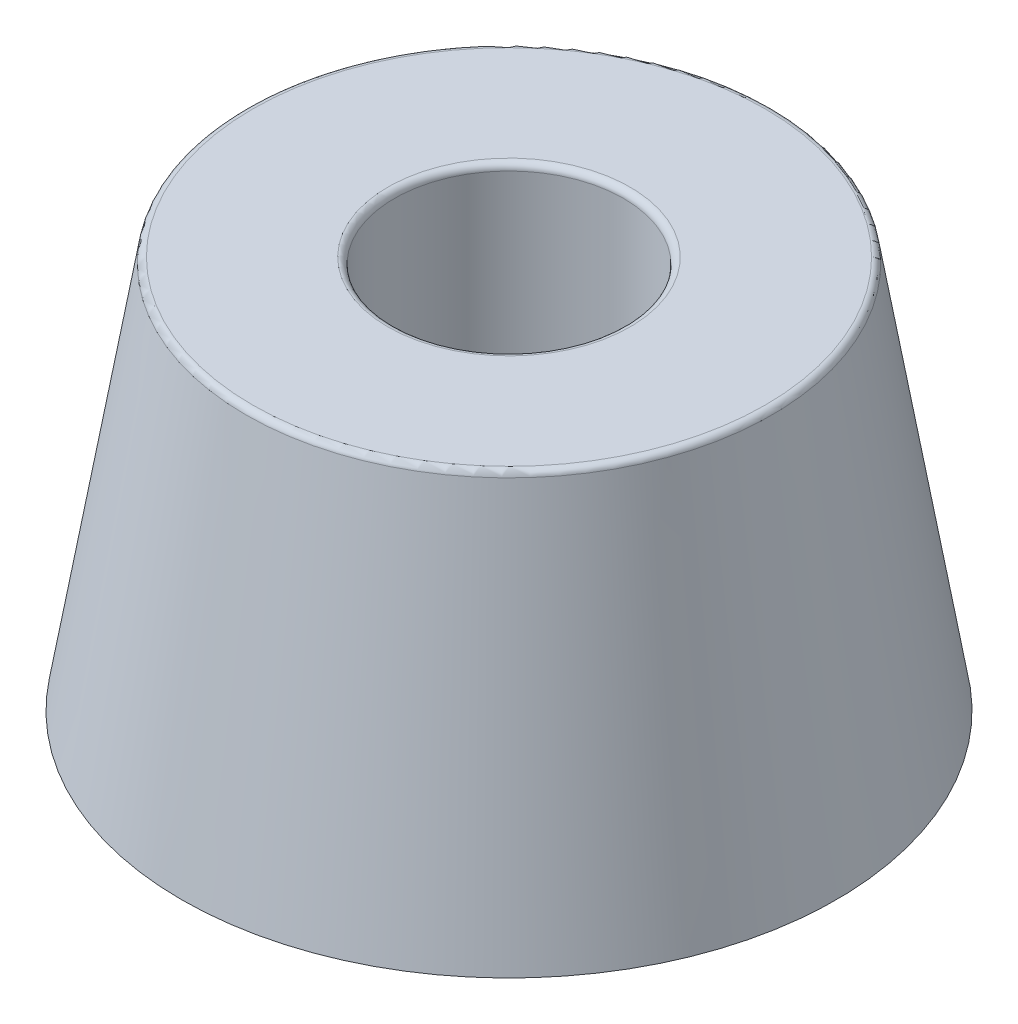
ISO-10303-21;
HEADER;
FILE_DESCRIPTION(('STEP AP214'),'2;1');
FILE_NAME('part.step','',(''),(''),'','','');
FILE_SCHEMA(('AUTOMOTIVE_DESIGN { 1 0 10303 214 1 1 1 1 }'));
ENDSEC;
DATA;
#1=APPLICATION_CONTEXT('core data for automotive mechanical design processes');
#2=APPLICATION_PROTOCOL_DEFINITION('international standard','automotive_design',2000,#1);
#3=PRODUCT_CONTEXT('',#1,'mechanical');
#4=PRODUCT('Part','Part','',(#3));
#5=PRODUCT_RELATED_PRODUCT_CATEGORY('part','',(#4));
#6=PRODUCT_DEFINITION_FORMATION('','',#4);
#7=PRODUCT_DEFINITION_CONTEXT('part definition',#1,'design');
#8=PRODUCT_DEFINITION('design','',#6,#7);
#9=PRODUCT_DEFINITION_SHAPE('','',#8);
#10=(LENGTH_UNIT() NAMED_UNIT(*) SI_UNIT(.MILLI.,.METRE.));
#11=(NAMED_UNIT(*) PLANE_ANGLE_UNIT() SI_UNIT($,.RADIAN.));
#12=(NAMED_UNIT(*) SI_UNIT($,.STERADIAN.) SOLID_ANGLE_UNIT());
#13=UNCERTAINTY_MEASURE_WITH_UNIT(LENGTH_MEASURE(1.E-05),#10,'distance_accuracy_value','');
#14=(GEOMETRIC_REPRESENTATION_CONTEXT(3) GLOBAL_UNCERTAINTY_ASSIGNED_CONTEXT((#13)) GLOBAL_UNIT_ASSIGNED_CONTEXT((#10,
#11,#12)) REPRESENTATION_CONTEXT('',''));
#15=CARTESIAN_POINT('',(0.,0.,0.));
#16=DIRECTION('',(0.,0.,1.));
#17=DIRECTION('',(1.,0.,0.));
#18=AXIS2_PLACEMENT_3D('',#15,#16,#17);
#19=CARTESIAN_POINT('',(0.,12.,0.));
#20=DIRECTION('',(0.,1.,0.));
#21=DIRECTION('',(0.,0.,1.));
#22=AXIS2_PLACEMENT_3D('',#19,#20,#21);
#23=PLANE('',#22);
#24=CARTESIAN_POINT('',(0.,12.,0.));
#25=DIRECTION('',(0.,1.,0.));
#26=DIRECTION('',(0.,0.,1.));
#27=AXIS2_PLACEMENT_3D('',#24,#25,#26);
#28=CIRCLE('',#27,7.83057458232339);
#29=CARTESIAN_POINT('',(0.,12.,7.83057458232339));
#30=VERTEX_POINT('',#29);
#31=EDGE_CURVE('E22',#30,#30,#28,.T.);
#32=ORIENTED_EDGE('',*,*,#31,.T.);
#33=EDGE_LOOP('',(#32));
#34=FACE_BOUND('',#33,.T.);
#35=CARTESIAN_POINT('',(0.,12.,0.));
#36=DIRECTION('',(0.,1.,0.));
#37=DIRECTION('',(0.,0.,1.));
#38=AXIS2_PLACEMENT_3D('',#35,#36,#37);
#39=CIRCLE('',#38,3.7);
#40=CARTESIAN_POINT('',(0.,12.,3.7));
#41=VERTEX_POINT('',#40);
#42=EDGE_CURVE('E26',#41,#41,#39,.F.);
#43=ORIENTED_EDGE('',*,*,#42,.T.);
#44=EDGE_LOOP('',(#43));
#45=FACE_BOUND('',#44,.T.);
#46=ADVANCED_FACE('F15',(#34,#45),#23,.T.);
#47=CARTESIAN_POINT('',(0.,0.,0.));
#48=DIRECTION('',(0.,-1.,0.));
#49=DIRECTION('',(0.,0.,-1.));
#50=AXIS2_PLACEMENT_3D('',#47,#48,#49);
#51=CONICAL_SURFACE('',#50,10.,0.165148677414627);
#52=CARTESIAN_POINT('',(0.,11.8328797974611,0.));
#53=DIRECTION('',(0.,1.,0.));
#54=DIRECTION('',(0.,0.,1.));
#55=AXIS2_PLACEMENT_3D('',#52,#53,#54);
#56=CIRCLE('',#55,8.02785336708982);
#57=CARTESIAN_POINT('',(0.,11.8328797974611,8.02785336708982));
#58=VERTEX_POINT('',#57);
#59=EDGE_CURVE('E30',#58,#58,#56,.F.);
#60=ORIENTED_EDGE('',*,*,#59,.T.);
#61=EDGE_LOOP('',(#60));
#62=FACE_BOUND('',#61,.T.);
#63=CARTESIAN_POINT('',(0.,0.,0.));
#64=DIRECTION('',(0.,-1.,0.));
#65=DIRECTION('',(0.,0.,-1.));
#66=AXIS2_PLACEMENT_3D('',#63,#64,#65);
#67=CIRCLE('',#66,10.);
#68=CARTESIAN_POINT('',(0.,0.,-10.));
#69=VERTEX_POINT('',#68);
#70=EDGE_CURVE('E35',#69,#69,#67,.T.);
#71=ORIENTED_EDGE('',*,*,#70,.F.);
#72=EDGE_LOOP('',(#71));
#73=FACE_BOUND('',#72,.T.);
#74=ADVANCED_FACE('F54',(#62,#73),#51,.T.);
#75=CARTESIAN_POINT('',(0.,0.,-10.));
#76=DIRECTION('',(0.,-1.,0.));
#77=DIRECTION('',(0.,0.,-1.));
#78=AXIS2_PLACEMENT_3D('',#75,#76,#77);
#79=PLANE('',#78);
#80=CARTESIAN_POINT('',(0.,0.,0.));
#81=DIRECTION('',(0.,-1.,0.));
#82=DIRECTION('',(0.,0.,-1.));
#83=AXIS2_PLACEMENT_3D('',#80,#81,#82);
#84=CIRCLE('',#83,2.);
#85=CARTESIAN_POINT('',(0.,0.,-2.));
#86=VERTEX_POINT('',#85);
#87=EDGE_CURVE('E44',#86,#86,#84,.T.);
#88=ORIENTED_EDGE('',*,*,#87,.F.);
#89=EDGE_LOOP('',(#88));
#90=FACE_BOUND('',#89,.T.);
#91=ORIENTED_EDGE('',*,*,#70,.T.);
#92=EDGE_LOOP('',(#91));
#93=FACE_BOUND('',#92,.T.);
#94=ADVANCED_FACE('F50',(#90,#93),#79,.T.);
#95=CARTESIAN_POINT('',(0.,0.,0.));
#96=DIRECTION('',(0.,-1.,0.));
#97=DIRECTION('',(0.,0.,-1.));
#98=AXIS2_PLACEMENT_3D('',#95,#96,#97);
#99=CYLINDRICAL_SURFACE('',#98,3.5);
#100=CARTESIAN_POINT('',(0.,11.8,0.));
#101=DIRECTION('',(0.,1.,0.));
#102=DIRECTION('',(0.,0.,1.));
#103=AXIS2_PLACEMENT_3D('',#100,#101,#102);
#104=CIRCLE('',#103,3.5);
#105=CARTESIAN_POINT('',(0.,11.8,3.5));
#106=VERTEX_POINT('',#105);
#107=EDGE_CURVE('E10',#106,#106,#104,.T.);
#108=ORIENTED_EDGE('',*,*,#107,.T.);
#109=EDGE_LOOP('',(#108));
#110=FACE_BOUND('',#109,.T.);
#111=CARTESIAN_POINT('',(0.,5.,0.));
#112=DIRECTION('',(0.,-1.,0.));
#113=DIRECTION('',(0.,0.,-1.));
#114=AXIS2_PLACEMENT_3D('',#111,#112,#113);
#115=CIRCLE('',#114,3.5);
#116=CARTESIAN_POINT('',(0.,5.,-3.5));
#117=VERTEX_POINT('',#116);
#118=EDGE_CURVE('E38',#117,#117,#115,.T.);
#119=ORIENTED_EDGE('',*,*,#118,.T.);
#120=EDGE_LOOP('',(#119));
#121=FACE_BOUND('',#120,.T.);
#122=ADVANCED_FACE('F53',(#110,#121),#99,.F.);
#123=CARTESIAN_POINT('',(0.,5.,-3.5));
#124=DIRECTION('',(0.,-1.,0.));
#125=DIRECTION('',(0.,0.,-1.));
#126=AXIS2_PLACEMENT_3D('',#123,#124,#125);
#127=PLANE('',#126);
#128=ORIENTED_EDGE('',*,*,#118,.F.);
#129=EDGE_LOOP('',(#128));
#130=FACE_BOUND('',#129,.T.);
#131=CARTESIAN_POINT('',(0.,5.,0.));
#132=DIRECTION('',(0.,-1.,0.));
#133=DIRECTION('',(0.,0.,-1.));
#134=AXIS2_PLACEMENT_3D('',#131,#132,#133);
#135=CIRCLE('',#134,2.);
#136=CARTESIAN_POINT('',(0.,5.,-2.));
#137=VERTEX_POINT('',#136);
#138=EDGE_CURVE('E41',#137,#137,#135,.T.);
#139=ORIENTED_EDGE('',*,*,#138,.T.);
#140=EDGE_LOOP('',(#139));
#141=FACE_BOUND('',#140,.T.);
#142=ADVANCED_FACE('F77',(#130,#141),#127,.F.);
#143=CARTESIAN_POINT('',(0.,0.,0.));
#144=DIRECTION('',(0.,-1.,0.));
#145=DIRECTION('',(0.,0.,-1.));
#146=AXIS2_PLACEMENT_3D('',#143,#144,#145);
#147=CYLINDRICAL_SURFACE('',#146,2.);
#148=ORIENTED_EDGE('',*,*,#138,.F.);
#149=EDGE_LOOP('',(#148));
#150=FACE_BOUND('',#149,.T.);
#151=ORIENTED_EDGE('',*,*,#87,.T.);
#152=EDGE_LOOP('',(#151));
#153=FACE_BOUND('',#152,.T.);
#154=ADVANCED_FACE('F48',(#150,#153),#147,.F.);
#155=CARTESIAN_POINT('',(0.,11.8,0.));
#156=DIRECTION('',(0.,1.,0.));
#157=DIRECTION('',(0.,0.,1.));
#158=AXIS2_PLACEMENT_3D('',#155,#156,#157);
#159=TOROIDAL_SURFACE('',#158,7.83057458232339,0.2);
#160=ORIENTED_EDGE('',*,*,#31,.F.);
#161=EDGE_LOOP('',(#160));
#162=FACE_BOUND('',#161,.T.);
#163=ORIENTED_EDGE('',*,*,#59,.F.);
#164=EDGE_LOOP('',(#163));
#165=FACE_BOUND('',#164,.T.);
#166=ADVANCED_FACE('F68',(#162,#165),#159,.T.);
#167=CARTESIAN_POINT('',(0.,11.8,0.));
#168=DIRECTION('',(0.,1.,0.));
#169=DIRECTION('',(0.,0.,1.));
#170=AXIS2_PLACEMENT_3D('',#167,#168,#169);
#171=TOROIDAL_SURFACE('',#170,3.7,0.2);
#172=ORIENTED_EDGE('',*,*,#107,.F.);
#173=EDGE_LOOP('',(#172));
#174=FACE_BOUND('',#173,.T.);
#175=ORIENTED_EDGE('',*,*,#42,.F.);
#176=EDGE_LOOP('',(#175));
#177=FACE_BOUND('',#176,.T.);
#178=ADVANCED_FACE('F17',(#174,#177),#171,.T.);
#179=CLOSED_SHELL('',(#46,#74,#94,#122,#142,#154,#166,#178));
#180=MANIFOLD_SOLID_BREP('B1',#179);
#181=ADVANCED_BREP_SHAPE_REPRESENTATION('',(#18,#180),#14);
#182=SHAPE_DEFINITION_REPRESENTATION(#9,#181);
ENDSEC;
END-ISO-10303-21;
